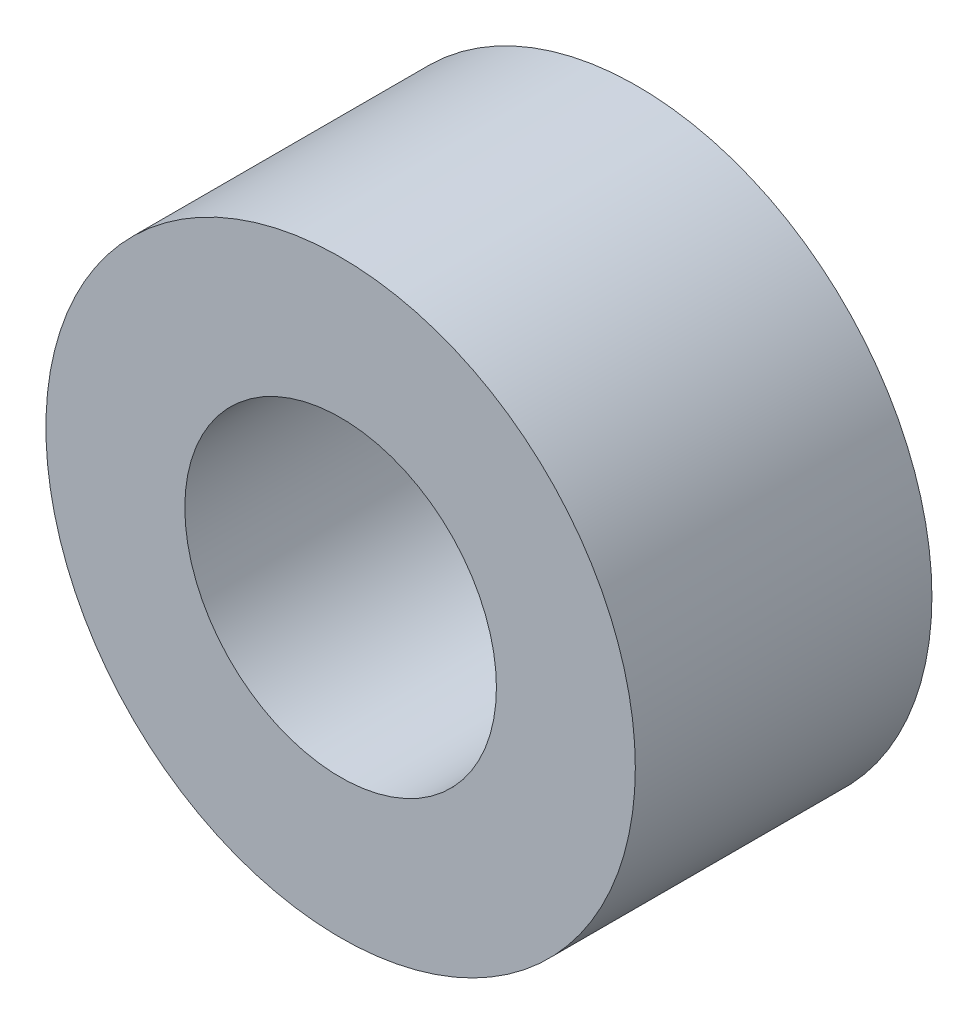
ISO-10303-21;
HEADER;
FILE_DESCRIPTION(('STEP AP214'),'2;1');
FILE_NAME('part.step','',(''),(''),'','','');
FILE_SCHEMA(('AUTOMOTIVE_DESIGN { 1 0 10303 214 1 1 1 1 }'));
ENDSEC;
DATA;
#1=APPLICATION_CONTEXT('core data for automotive mechanical design processes');
#2=APPLICATION_PROTOCOL_DEFINITION('international standard','automotive_design',2000,#1);
#3=PRODUCT_CONTEXT('',#1,'mechanical');
#4=PRODUCT('Part','Part','',(#3));
#5=PRODUCT_RELATED_PRODUCT_CATEGORY('part','',(#4));
#6=PRODUCT_DEFINITION_FORMATION('','',#4);
#7=PRODUCT_DEFINITION_CONTEXT('part definition',#1,'design');
#8=PRODUCT_DEFINITION('design','',#6,#7);
#9=PRODUCT_DEFINITION_SHAPE('','',#8);
#10=(LENGTH_UNIT() NAMED_UNIT(*) SI_UNIT(.MILLI.,.METRE.));
#11=(NAMED_UNIT(*) PLANE_ANGLE_UNIT() SI_UNIT($,.RADIAN.));
#12=(NAMED_UNIT(*) SI_UNIT($,.STERADIAN.) SOLID_ANGLE_UNIT());
#13=UNCERTAINTY_MEASURE_WITH_UNIT(LENGTH_MEASURE(1.E-05),#10,'distance_accuracy_value','');
#14=(GEOMETRIC_REPRESENTATION_CONTEXT(3) GLOBAL_UNCERTAINTY_ASSIGNED_CONTEXT((#13)) GLOBAL_UNIT_ASSIGNED_CONTEXT((#10,
#11,#12)) REPRESENTATION_CONTEXT('',''));
#15=CARTESIAN_POINT('',(0.,0.,0.));
#16=DIRECTION('',(0.,0.,1.));
#17=DIRECTION('',(1.,0.,0.));
#18=AXIS2_PLACEMENT_3D('',#15,#16,#17);
#19=CARTESIAN_POINT('',(0.,0.,7.9));
#20=DIRECTION('',(0.,0.,1.));
#21=DIRECTION('',(1.,0.,0.));
#22=AXIS2_PLACEMENT_3D('',#19,#20,#21);
#23=PLANE('',#22);
#24=CARTESIAN_POINT('',(0.,0.,7.9));
#25=DIRECTION('',(0.,0.,1.));
#26=DIRECTION('',(1.,0.,0.));
#27=AXIS2_PLACEMENT_3D('',#24,#25,#26);
#28=CIRCLE('',#27,7.85);
#29=CARTESIAN_POINT('',(7.85,0.,7.9));
#30=VERTEX_POINT('',#29);
#31=EDGE_CURVE('E10',#30,#30,#28,.T.);
#32=ORIENTED_EDGE('',*,*,#31,.T.);
#33=EDGE_LOOP('',(#32));
#34=FACE_BOUND('',#33,.T.);
#35=CARTESIAN_POINT('',(0.,0.,7.9));
#36=DIRECTION('',(0.,0.,1.));
#37=DIRECTION('',(1.,0.,0.));
#38=AXIS2_PLACEMENT_3D('',#35,#36,#37);
#39=CIRCLE('',#38,4.15);
#40=CARTESIAN_POINT('',(4.15,0.,7.9));
#41=VERTEX_POINT('',#40);
#42=EDGE_CURVE('E42',#41,#41,#39,.T.);
#43=ORIENTED_EDGE('',*,*,#42,.F.);
#44=EDGE_LOOP('',(#43));
#45=FACE_BOUND('',#44,.T.);
#46=ADVANCED_FACE('F31',(#34,#45),#23,.T.);
#47=CARTESIAN_POINT('',(0.,0.,0.));
#48=DIRECTION('',(0.,0.,1.));
#49=DIRECTION('',(1.,0.,0.));
#50=AXIS2_PLACEMENT_3D('',#47,#48,#49);
#51=PLANE('',#50);
#52=CARTESIAN_POINT('',(0.,0.,0.));
#53=DIRECTION('',(0.,0.,1.));
#54=DIRECTION('',(1.,0.,0.));
#55=AXIS2_PLACEMENT_3D('',#52,#53,#54);
#56=CIRCLE('',#55,7.85);
#57=CARTESIAN_POINT('',(7.85,0.,0.));
#58=VERTEX_POINT('',#57);
#59=EDGE_CURVE('E35',#58,#58,#56,.T.);
#60=ORIENTED_EDGE('',*,*,#59,.F.);
#61=EDGE_LOOP('',(#60));
#62=FACE_BOUND('',#61,.T.);
#63=CARTESIAN_POINT('',(0.,0.,0.));
#64=DIRECTION('',(0.,0.,1.));
#65=DIRECTION('',(1.,0.,0.));
#66=AXIS2_PLACEMENT_3D('',#63,#64,#65);
#67=CIRCLE('',#66,4.15);
#68=CARTESIAN_POINT('',(4.15,0.,0.));
#69=VERTEX_POINT('',#68);
#70=EDGE_CURVE('E44',#69,#69,#67,.T.);
#71=ORIENTED_EDGE('',*,*,#70,.T.);
#72=EDGE_LOOP('',(#71));
#73=FACE_BOUND('',#72,.T.);
#74=ADVANCED_FACE('F54',(#62,#73),#51,.F.);
#75=CARTESIAN_POINT('',(0.,0.,7.9));
#76=DIRECTION('',(0.,0.,-1.));
#77=DIRECTION('',(-1.,0.,0.));
#78=AXIS2_PLACEMENT_3D('',#75,#76,#77);
#79=CYLINDRICAL_SURFACE('',#78,7.85);
#80=ORIENTED_EDGE('',*,*,#31,.F.);
#81=EDGE_LOOP('',(#80));
#82=FACE_BOUND('',#81,.T.);
#83=ORIENTED_EDGE('',*,*,#59,.T.);
#84=EDGE_LOOP('',(#83));
#85=FACE_BOUND('',#84,.T.);
#86=ADVANCED_FACE('F33',(#82,#85),#79,.T.);
#87=CARTESIAN_POINT('',(0.,0.,7.9));
#88=DIRECTION('',(0.,0.,-1.));
#89=DIRECTION('',(-1.,0.,0.));
#90=AXIS2_PLACEMENT_3D('',#87,#88,#89);
#91=CYLINDRICAL_SURFACE('',#90,4.15);
#92=ORIENTED_EDGE('',*,*,#42,.T.);
#93=EDGE_LOOP('',(#92));
#94=FACE_BOUND('',#93,.T.);
#95=ORIENTED_EDGE('',*,*,#70,.F.);
#96=EDGE_LOOP('',(#95));
#97=FACE_BOUND('',#96,.T.);
#98=ADVANCED_FACE('F50',(#94,#97),#91,.F.);
#99=CLOSED_SHELL('',(#46,#74,#86,#98));
#100=MANIFOLD_SOLID_BREP('B2',#99);
#101=ADVANCED_BREP_SHAPE_REPRESENTATION('',(#18,#100),#14);
#102=SHAPE_DEFINITION_REPRESENTATION(#9,#101);
ENDSEC;
END-ISO-10303-21;
